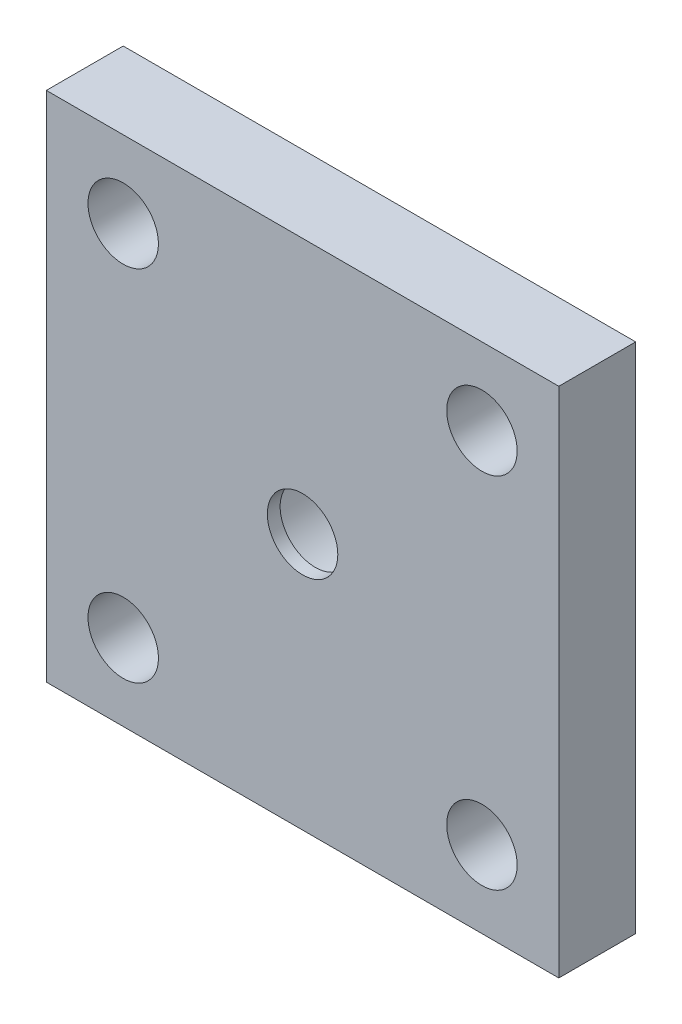
ISO-10303-21;
HEADER;
FILE_DESCRIPTION(('STEP AP214'),'2;1');
FILE_NAME('part.step','',(''),(''),'','','');
FILE_SCHEMA(('AUTOMOTIVE_DESIGN { 1 0 10303 214 1 1 1 1 }'));
ENDSEC;
DATA;
#1=APPLICATION_CONTEXT('core data for automotive mechanical design processes');
#2=APPLICATION_PROTOCOL_DEFINITION('international standard','automotive_design',2000,#1);
#3=PRODUCT_CONTEXT('',#1,'mechanical');
#4=PRODUCT('Part','Part','',(#3));
#5=PRODUCT_RELATED_PRODUCT_CATEGORY('part','',(#4));
#6=PRODUCT_DEFINITION_FORMATION('','',#4);
#7=PRODUCT_DEFINITION_CONTEXT('part definition',#1,'design');
#8=PRODUCT_DEFINITION('design','',#6,#7);
#9=PRODUCT_DEFINITION_SHAPE('','',#8);
#10=(LENGTH_UNIT() NAMED_UNIT(*) SI_UNIT(.MILLI.,.METRE.));
#11=(NAMED_UNIT(*) PLANE_ANGLE_UNIT() SI_UNIT($,.RADIAN.));
#12=(NAMED_UNIT(*) SI_UNIT($,.STERADIAN.) SOLID_ANGLE_UNIT());
#13=UNCERTAINTY_MEASURE_WITH_UNIT(LENGTH_MEASURE(1.E-05),#10,'distance_accuracy_value','');
#14=(GEOMETRIC_REPRESENTATION_CONTEXT(3) GLOBAL_UNCERTAINTY_ASSIGNED_CONTEXT((#13)) GLOBAL_UNIT_ASSIGNED_CONTEXT((#10,
#11,#12)) REPRESENTATION_CONTEXT('',''));
#15=CARTESIAN_POINT('',(0.,0.,0.));
#16=DIRECTION('',(0.,0.,1.));
#17=DIRECTION('',(1.,0.,0.));
#18=AXIS2_PLACEMENT_3D('',#15,#16,#17);
#19=CARTESIAN_POINT('',(0.,0.,5.));
#20=DIRECTION('',(0.,0.,1.));
#21=DIRECTION('',(1.,0.,0.));
#22=AXIS2_PLACEMENT_3D('',#19,#20,#21);
#23=PLANE('',#22);
#24=CARTESIAN_POINT('',(0.,0.,5.));
#25=DIRECTION('',(0.,0.,1.));
#26=DIRECTION('',(1.,0.,0.));
#27=AXIS2_PLACEMENT_3D('',#24,#25,#26);
#28=CIRCLE('',#27,2.75);
#29=CARTESIAN_POINT('',(2.75,0.,5.));
#30=VERTEX_POINT('',#29);
#31=EDGE_CURVE('E25',#30,#30,#28,.T.);
#32=ORIENTED_EDGE('',*,*,#31,.T.);
#33=EDGE_LOOP('',(#32));
#34=FACE_BOUND('',#33,.T.);
#35=CARTESIAN_POINT('',(0.,0.,5.));
#36=DIRECTION('',(0.,0.,1.));
#37=DIRECTION('',(1.,0.,0.));
#38=AXIS2_PLACEMENT_3D('',#35,#36,#37);
#39=CIRCLE('',#38,4.75);
#40=CARTESIAN_POINT('',(4.75,0.,5.));
#41=VERTEX_POINT('',#40);
#42=EDGE_CURVE('E10',#41,#41,#39,.T.);
#43=ORIENTED_EDGE('',*,*,#42,.F.);
#44=EDGE_LOOP('',(#43));
#45=FACE_BOUND('',#44,.T.);
#46=ADVANCED_FACE('F16',(#34,#45),#23,.F.);
#47=CARTESIAN_POINT('',(0.,0.,-1.));
#48=DIRECTION('',(0.,0.,1.));
#49=DIRECTION('',(1.,0.,0.));
#50=AXIS2_PLACEMENT_3D('',#47,#48,#49);
#51=CYLINDRICAL_SURFACE('',#50,4.75);
#52=ORIENTED_EDGE('',*,*,#42,.T.);
#53=EDGE_LOOP('',(#52));
#54=FACE_BOUND('',#53,.T.);
#55=CARTESIAN_POINT('',(0.,0.,0.));
#56=DIRECTION('',(0.,0.,1.));
#57=DIRECTION('',(1.,0.,0.));
#58=AXIS2_PLACEMENT_3D('',#55,#56,#57);
#59=CIRCLE('',#58,4.75);
#60=CARTESIAN_POINT('',(4.75,0.,0.));
#61=VERTEX_POINT('',#60);
#62=EDGE_CURVE('E154',#61,#61,#59,.T.);
#63=ORIENTED_EDGE('',*,*,#62,.F.);
#64=EDGE_LOOP('',(#63));
#65=FACE_BOUND('',#64,.T.);
#66=ADVANCED_FACE('F181',(#54,#65),#51,.F.);
#67=CARTESIAN_POINT('',(14.,14.,-1.));
#68=DIRECTION('',(0.,0.,1.));
#69=DIRECTION('',(1.,0.,0.));
#70=AXIS2_PLACEMENT_3D('',#67,#68,#69);
#71=CYLINDRICAL_SURFACE('',#70,2.75);
#72=CARTESIAN_POINT('',(14.,14.,6.));
#73=DIRECTION('',(0.,0.,1.));
#74=DIRECTION('',(1.,0.,0.));
#75=AXIS2_PLACEMENT_3D('',#72,#73,#74);
#76=CIRCLE('',#75,2.75);
#77=CARTESIAN_POINT('',(16.75,14.,6.));
#78=VERTEX_POINT('',#77);
#79=EDGE_CURVE('E130',#78,#78,#76,.T.);
#80=ORIENTED_EDGE('',*,*,#79,.T.);
#81=EDGE_LOOP('',(#80));
#82=FACE_BOUND('',#81,.T.);
#83=CARTESIAN_POINT('',(14.,14.,0.));
#84=DIRECTION('',(0.,0.,1.));
#85=DIRECTION('',(1.,0.,0.));
#86=AXIS2_PLACEMENT_3D('',#83,#84,#85);
#87=CIRCLE('',#86,2.75);
#88=CARTESIAN_POINT('',(16.75,14.,0.));
#89=VERTEX_POINT('',#88);
#90=EDGE_CURVE('E158',#89,#89,#87,.T.);
#91=ORIENTED_EDGE('',*,*,#90,.F.);
#92=EDGE_LOOP('',(#91));
#93=FACE_BOUND('',#92,.T.);
#94=ADVANCED_FACE('F18',(#82,#93),#71,.F.);
#95=CARTESIAN_POINT('',(0.,0.,-1.));
#96=DIRECTION('',(0.,0.,1.));
#97=DIRECTION('',(1.,0.,0.));
#98=AXIS2_PLACEMENT_3D('',#95,#96,#97);
#99=CYLINDRICAL_SURFACE('',#98,2.75);
#100=CARTESIAN_POINT('',(0.,0.,6.));
#101=DIRECTION('',(0.,0.,1.));
#102=DIRECTION('',(1.,0.,0.));
#103=AXIS2_PLACEMENT_3D('',#100,#101,#102);
#104=CIRCLE('',#103,2.75);
#105=CARTESIAN_POINT('',(2.75,0.,6.));
#106=VERTEX_POINT('',#105);
#107=EDGE_CURVE('E126',#106,#106,#104,.T.);
#108=ORIENTED_EDGE('',*,*,#107,.T.);
#109=EDGE_LOOP('',(#108));
#110=FACE_BOUND('',#109,.T.);
#111=ORIENTED_EDGE('',*,*,#31,.F.);
#112=EDGE_LOOP('',(#111));
#113=FACE_BOUND('',#112,.T.);
#114=ADVANCED_FACE('F168',(#110,#113),#99,.F.);
#115=CARTESIAN_POINT('',(-14.,14.,-1.));
#116=DIRECTION('',(0.,0.,1.));
#117=DIRECTION('',(1.,0.,0.));
#118=AXIS2_PLACEMENT_3D('',#115,#116,#117);
#119=CYLINDRICAL_SURFACE('',#118,2.75);
#120=CARTESIAN_POINT('',(-14.,14.,6.));
#121=DIRECTION('',(0.,0.,1.));
#122=DIRECTION('',(1.,0.,0.));
#123=AXIS2_PLACEMENT_3D('',#120,#121,#122);
#124=CIRCLE('',#123,2.75);
#125=CARTESIAN_POINT('',(-11.25,14.,6.));
#126=VERTEX_POINT('',#125);
#127=EDGE_CURVE('E119',#126,#126,#124,.T.);
#128=ORIENTED_EDGE('',*,*,#127,.T.);
#129=EDGE_LOOP('',(#128));
#130=FACE_BOUND('',#129,.T.);
#131=CARTESIAN_POINT('',(-14.,14.,0.));
#132=DIRECTION('',(0.,0.,1.));
#133=DIRECTION('',(1.,0.,0.));
#134=AXIS2_PLACEMENT_3D('',#131,#132,#133);
#135=CIRCLE('',#134,2.75);
#136=CARTESIAN_POINT('',(-11.25,14.,0.));
#137=VERTEX_POINT('',#136);
#138=EDGE_CURVE('E150',#137,#137,#135,.T.);
#139=ORIENTED_EDGE('',*,*,#138,.F.);
#140=EDGE_LOOP('',(#139));
#141=FACE_BOUND('',#140,.T.);
#142=ADVANCED_FACE('F170',(#130,#141),#119,.F.);
#143=CARTESIAN_POINT('',(14.,-14.,-1.));
#144=DIRECTION('',(0.,0.,1.));
#145=DIRECTION('',(1.,0.,0.));
#146=AXIS2_PLACEMENT_3D('',#143,#144,#145);
#147=CYLINDRICAL_SURFACE('',#146,2.75);
#148=CARTESIAN_POINT('',(14.,-14.,6.));
#149=DIRECTION('',(0.,0.,1.));
#150=DIRECTION('',(1.,0.,0.));
#151=AXIS2_PLACEMENT_3D('',#148,#149,#150);
#152=CIRCLE('',#151,2.75);
#153=CARTESIAN_POINT('',(16.75,-14.,6.));
#154=VERTEX_POINT('',#153);
#155=EDGE_CURVE('E115',#154,#154,#152,.T.);
#156=ORIENTED_EDGE('',*,*,#155,.T.);
#157=EDGE_LOOP('',(#156));
#158=FACE_BOUND('',#157,.T.);
#159=CARTESIAN_POINT('',(14.,-14.,0.));
#160=DIRECTION('',(0.,0.,1.));
#161=DIRECTION('',(1.,0.,0.));
#162=AXIS2_PLACEMENT_3D('',#159,#160,#161);
#163=CIRCLE('',#162,2.75);
#164=CARTESIAN_POINT('',(16.75,-14.,0.));
#165=VERTEX_POINT('',#164);
#166=EDGE_CURVE('E146',#165,#165,#163,.T.);
#167=ORIENTED_EDGE('',*,*,#166,.F.);
#168=EDGE_LOOP('',(#167));
#169=FACE_BOUND('',#168,.T.);
#170=ADVANCED_FACE('F178',(#158,#169),#147,.F.);
#171=CARTESIAN_POINT('',(-14.,-14.,-1.));
#172=DIRECTION('',(0.,0.,1.));
#173=DIRECTION('',(1.,0.,0.));
#174=AXIS2_PLACEMENT_3D('',#171,#172,#173);
#175=CYLINDRICAL_SURFACE('',#174,2.75);
#176=CARTESIAN_POINT('',(-14.,-14.,6.));
#177=DIRECTION('',(0.,0.,1.));
#178=DIRECTION('',(1.,0.,0.));
#179=AXIS2_PLACEMENT_3D('',#176,#177,#178);
#180=CIRCLE('',#179,2.75);
#181=CARTESIAN_POINT('',(-11.25,-14.,6.));
#182=VERTEX_POINT('',#181);
#183=EDGE_CURVE('E120',#182,#182,#180,.T.);
#184=ORIENTED_EDGE('',*,*,#183,.T.);
#185=EDGE_LOOP('',(#184));
#186=FACE_BOUND('',#185,.T.);
#187=CARTESIAN_POINT('',(-14.,-14.,0.));
#188=DIRECTION('',(0.,0.,1.));
#189=DIRECTION('',(1.,0.,0.));
#190=AXIS2_PLACEMENT_3D('',#187,#188,#189);
#191=CIRCLE('',#190,2.75);
#192=CARTESIAN_POINT('',(-11.25,-14.,0.));
#193=VERTEX_POINT('',#192);
#194=EDGE_CURVE('E142',#193,#193,#191,.T.);
#195=ORIENTED_EDGE('',*,*,#194,.F.);
#196=EDGE_LOOP('',(#195));
#197=FACE_BOUND('',#196,.T.);
#198=ADVANCED_FACE('F199',(#186,#197),#175,.F.);
#199=CARTESIAN_POINT('',(20.,-20.,0.));
#200=DIRECTION('',(1.,0.,0.));
#201=DIRECTION('',(0.,1.,0.));
#202=AXIS2_PLACEMENT_3D('',#199,#200,#201);
#203=PLANE('',#202);
#204=DIRECTION('',(0.,0.,1.));
#205=VECTOR('',#204,1.);
#206=CARTESIAN_POINT('',(20.,-20.,0.));
#207=LINE('',#206,#205);
#208=CARTESIAN_POINT('',(20.,-20.,0.));
#209=VERTEX_POINT('',#208);
#210=CARTESIAN_POINT('',(20.,-20.,6.));
#211=VERTEX_POINT('',#210);
#212=EDGE_CURVE('E77',#209,#211,#207,.T.);
#213=ORIENTED_EDGE('',*,*,#212,.F.);
#214=DIRECTION('',(0.,1.,0.));
#215=VECTOR('',#214,1.);
#216=CARTESIAN_POINT('',(20.,-20.,0.));
#217=LINE('',#216,#215);
#218=CARTESIAN_POINT('',(20.,20.,0.));
#219=VERTEX_POINT('',#218);
#220=EDGE_CURVE('E37',#209,#219,#217,.T.);
#221=ORIENTED_EDGE('',*,*,#220,.T.);
#222=DIRECTION('',(0.,0.,1.));
#223=VECTOR('',#222,1.);
#224=CARTESIAN_POINT('',(20.,20.,0.));
#225=LINE('',#224,#223);
#226=CARTESIAN_POINT('',(20.,20.,6.));
#227=VERTEX_POINT('',#226);
#228=EDGE_CURVE('E43',#219,#227,#225,.T.);
#229=ORIENTED_EDGE('',*,*,#228,.T.);
#230=DIRECTION('',(0.,1.,0.));
#231=VECTOR('',#230,1.);
#232=CARTESIAN_POINT('',(20.,-20.,6.));
#233=LINE('',#232,#231);
#234=EDGE_CURVE('E106',#211,#227,#233,.T.);
#235=ORIENTED_EDGE('',*,*,#234,.F.);
#236=EDGE_LOOP('',(#213,#221,#229,#235));
#237=FACE_BOUND('',#236,.T.);
#238=ADVANCED_FACE('F196',(#237),#203,.T.);
#239=CARTESIAN_POINT('',(-20.,-20.,0.));
#240=DIRECTION('',(0.,0.,1.));
#241=DIRECTION('',(1.,0.,0.));
#242=AXIS2_PLACEMENT_3D('',#239,#240,#241);
#243=PLANE('',#242);
#244=ORIENTED_EDGE('',*,*,#90,.T.);
#245=EDGE_LOOP('',(#244));
#246=FACE_BOUND('',#245,.T.);
#247=ORIENTED_EDGE('',*,*,#62,.T.);
#248=EDGE_LOOP('',(#247));
#249=FACE_BOUND('',#248,.T.);
#250=ORIENTED_EDGE('',*,*,#138,.T.);
#251=EDGE_LOOP('',(#250));
#252=FACE_BOUND('',#251,.T.);
#253=ORIENTED_EDGE('',*,*,#166,.T.);
#254=EDGE_LOOP('',(#253));
#255=FACE_BOUND('',#254,.T.);
#256=ORIENTED_EDGE('',*,*,#194,.T.);
#257=EDGE_LOOP('',(#256));
#258=FACE_BOUND('',#257,.T.);
#259=DIRECTION('',(1.,0.,0.));
#260=VECTOR('',#259,1.);
#261=CARTESIAN_POINT('',(-20.,20.,0.));
#262=LINE('',#261,#260);
#263=CARTESIAN_POINT('',(-20.,20.,0.));
#264=VERTEX_POINT('',#263);
#265=EDGE_CURVE('E114',#264,#219,#262,.T.);
#266=ORIENTED_EDGE('',*,*,#265,.T.);
#267=ORIENTED_EDGE('',*,*,#220,.F.);
#268=DIRECTION('',(1.,0.,0.));
#269=VECTOR('',#268,1.);
#270=CARTESIAN_POINT('',(-20.,-20.,0.));
#271=LINE('',#270,#269);
#272=CARTESIAN_POINT('',(-20.,-20.,0.));
#273=VERTEX_POINT('',#272);
#274=EDGE_CURVE('E82',#273,#209,#271,.T.);
#275=ORIENTED_EDGE('',*,*,#274,.F.);
#276=DIRECTION('',(0.,1.,0.));
#277=VECTOR('',#276,1.);
#278=CARTESIAN_POINT('',(-20.,-20.,0.));
#279=LINE('',#278,#277);
#280=EDGE_CURVE('E90',#273,#264,#279,.T.);
#281=ORIENTED_EDGE('',*,*,#280,.T.);
#282=EDGE_LOOP('',(#266,#267,#275,#281));
#283=FACE_BOUND('',#282,.T.);
#284=ADVANCED_FACE('F193',(#246,#249,#252,#255,#258,#283),#243,.F.);
#285=CARTESIAN_POINT('',(-20.,20.,0.));
#286=DIRECTION('',(0.,1.,0.));
#287=DIRECTION('',(1.,0.,0.));
#288=AXIS2_PLACEMENT_3D('',#285,#286,#287);
#289=PLANE('',#288);
#290=ORIENTED_EDGE('',*,*,#265,.F.);
#291=DIRECTION('',(0.,0.,1.));
#292=VECTOR('',#291,1.);
#293=CARTESIAN_POINT('',(-20.,20.,0.));
#294=LINE('',#293,#292);
#295=CARTESIAN_POINT('',(-20.,20.,6.));
#296=VERTEX_POINT('',#295);
#297=EDGE_CURVE('E97',#264,#296,#294,.T.);
#298=ORIENTED_EDGE('',*,*,#297,.T.);
#299=DIRECTION('',(1.,0.,0.));
#300=VECTOR('',#299,1.);
#301=CARTESIAN_POINT('',(-20.,20.,6.));
#302=LINE('',#301,#300);
#303=EDGE_CURVE('E94',#296,#227,#302,.T.);
#304=ORIENTED_EDGE('',*,*,#303,.T.);
#305=ORIENTED_EDGE('',*,*,#228,.F.);
#306=EDGE_LOOP('',(#290,#298,#304,#305));
#307=FACE_BOUND('',#306,.T.);
#308=ADVANCED_FACE('F195',(#307),#289,.T.);
#309=CARTESIAN_POINT('',(-20.,-20.,6.));
#310=DIRECTION('',(0.,0.,1.));
#311=DIRECTION('',(1.,0.,0.));
#312=AXIS2_PLACEMENT_3D('',#309,#310,#311);
#313=PLANE('',#312);
#314=ORIENTED_EDGE('',*,*,#79,.F.);
#315=EDGE_LOOP('',(#314));
#316=FACE_BOUND('',#315,.T.);
#317=ORIENTED_EDGE('',*,*,#107,.F.);
#318=EDGE_LOOP('',(#317));
#319=FACE_BOUND('',#318,.T.);
#320=ORIENTED_EDGE('',*,*,#127,.F.);
#321=EDGE_LOOP('',(#320));
#322=FACE_BOUND('',#321,.T.);
#323=ORIENTED_EDGE('',*,*,#155,.F.);
#324=EDGE_LOOP('',(#323));
#325=FACE_BOUND('',#324,.T.);
#326=ORIENTED_EDGE('',*,*,#183,.F.);
#327=EDGE_LOOP('',(#326));
#328=FACE_BOUND('',#327,.T.);
#329=DIRECTION('',(0.,1.,0.));
#330=VECTOR('',#329,1.);
#331=CARTESIAN_POINT('',(-20.,-20.,6.));
#332=LINE('',#331,#330);
#333=CARTESIAN_POINT('',(-20.,-20.,6.));
#334=VERTEX_POINT('',#333);
#335=EDGE_CURVE('E88',#334,#296,#332,.T.);
#336=ORIENTED_EDGE('',*,*,#335,.F.);
#337=DIRECTION('',(1.,0.,0.));
#338=VECTOR('',#337,1.);
#339=CARTESIAN_POINT('',(-20.,-20.,6.));
#340=LINE('',#339,#338);
#341=EDGE_CURVE('E71',#334,#211,#340,.T.);
#342=ORIENTED_EDGE('',*,*,#341,.T.);
#343=ORIENTED_EDGE('',*,*,#234,.T.);
#344=ORIENTED_EDGE('',*,*,#303,.F.);
#345=EDGE_LOOP('',(#336,#342,#343,#344));
#346=FACE_BOUND('',#345,.T.);
#347=ADVANCED_FACE('F93',(#316,#319,#322,#325,#328,#346),#313,.T.);
#348=CARTESIAN_POINT('',(-20.,-20.,0.));
#349=DIRECTION('',(0.,1.,0.));
#350=DIRECTION('',(1.,0.,0.));
#351=AXIS2_PLACEMENT_3D('',#348,#349,#350);
#352=PLANE('',#351);
#353=ORIENTED_EDGE('',*,*,#212,.T.);
#354=ORIENTED_EDGE('',*,*,#341,.F.);
#355=DIRECTION('',(0.,0.,1.));
#356=VECTOR('',#355,1.);
#357=CARTESIAN_POINT('',(-20.,-20.,0.));
#358=LINE('',#357,#356);
#359=EDGE_CURVE('E75',#273,#334,#358,.T.);
#360=ORIENTED_EDGE('',*,*,#359,.F.);
#361=ORIENTED_EDGE('',*,*,#274,.T.);
#362=EDGE_LOOP('',(#353,#354,#360,#361));
#363=FACE_BOUND('',#362,.T.);
#364=ADVANCED_FACE('F73',(#363),#352,.F.);
#365=CARTESIAN_POINT('',(-20.,-20.,0.));
#366=DIRECTION('',(1.,0.,0.));
#367=DIRECTION('',(0.,1.,0.));
#368=AXIS2_PLACEMENT_3D('',#365,#366,#367);
#369=PLANE('',#368);
#370=ORIENTED_EDGE('',*,*,#335,.T.);
#371=ORIENTED_EDGE('',*,*,#297,.F.);
#372=ORIENTED_EDGE('',*,*,#280,.F.);
#373=ORIENTED_EDGE('',*,*,#359,.T.);
#374=EDGE_LOOP('',(#370,#371,#372,#373));
#375=FACE_BOUND('',#374,.T.);
#376=ADVANCED_FACE('F86',(#375),#369,.F.);
#377=CLOSED_SHELL('',(#46,#66,#94,#114,#142,#170,#198,#238,#284,#308,#347,#364,#376));
#378=MANIFOLD_SOLID_BREP('B1',#377);
#379=ADVANCED_BREP_SHAPE_REPRESENTATION('',(#18,#378),#14);
#380=SHAPE_DEFINITION_REPRESENTATION(#9,#379);
ENDSEC;
END-ISO-10303-21;
